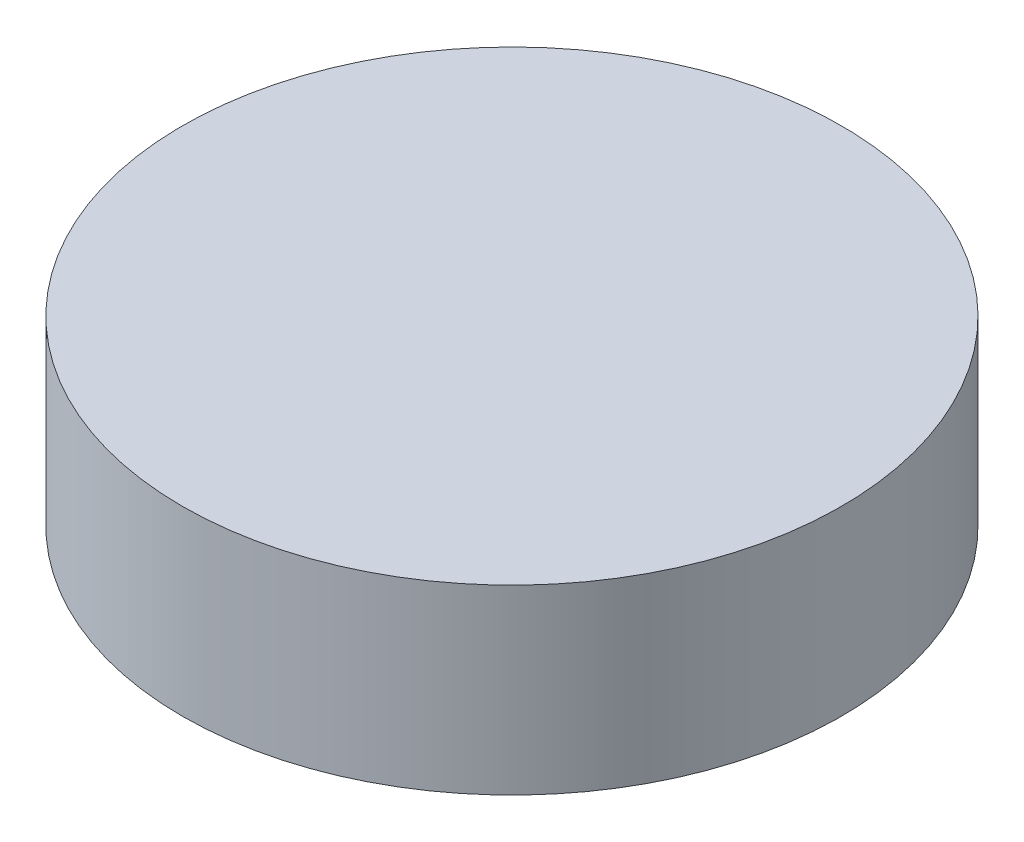
ISO-10303-21;
HEADER;
FILE_DESCRIPTION(('STEP AP214'),'2;1');
FILE_NAME('part.step','',(''),(''),'','','');
FILE_SCHEMA(('AUTOMOTIVE_DESIGN { 1 0 10303 214 1 1 1 1 }'));
ENDSEC;
DATA;
#1=APPLICATION_CONTEXT('core data for automotive mechanical design processes');
#2=APPLICATION_PROTOCOL_DEFINITION('international standard','automotive_design',2000,#1);
#3=PRODUCT_CONTEXT('',#1,'mechanical');
#4=PRODUCT('Part','Part','',(#3));
#5=PRODUCT_RELATED_PRODUCT_CATEGORY('part','',(#4));
#6=PRODUCT_DEFINITION_FORMATION('','',#4);
#7=PRODUCT_DEFINITION_CONTEXT('part definition',#1,'design');
#8=PRODUCT_DEFINITION('design','',#6,#7);
#9=PRODUCT_DEFINITION_SHAPE('','',#8);
#10=(LENGTH_UNIT() NAMED_UNIT(*) SI_UNIT(.MILLI.,.METRE.));
#11=(NAMED_UNIT(*) PLANE_ANGLE_UNIT() SI_UNIT($,.RADIAN.));
#12=(NAMED_UNIT(*) SI_UNIT($,.STERADIAN.) SOLID_ANGLE_UNIT());
#13=UNCERTAINTY_MEASURE_WITH_UNIT(LENGTH_MEASURE(1.E-05),#10,'distance_accuracy_value','');
#14=(GEOMETRIC_REPRESENTATION_CONTEXT(3) GLOBAL_UNCERTAINTY_ASSIGNED_CONTEXT((#13)) GLOBAL_UNIT_ASSIGNED_CONTEXT((#10,
#11,#12)) REPRESENTATION_CONTEXT('',''));
#15=CARTESIAN_POINT('',(0.,0.,0.));
#16=DIRECTION('',(0.,0.,1.));
#17=DIRECTION('',(1.,0.,0.));
#18=AXIS2_PLACEMENT_3D('',#15,#16,#17);
#19=CARTESIAN_POINT('',(0.,5.85,0.));
#20=DIRECTION('',(0.,-1.,0.));
#21=DIRECTION('',(0.,0.,-1.));
#22=AXIS2_PLACEMENT_3D('',#19,#20,#21);
#23=CYLINDRICAL_SURFACE('',#22,10.605);
#24=CARTESIAN_POINT('',(0.,5.85,0.));
#25=DIRECTION('',(0.,1.,0.));
#26=DIRECTION('',(0.,0.,1.));
#27=AXIS2_PLACEMENT_3D('',#24,#25,#26);
#28=CIRCLE('',#27,10.605);
#29=CARTESIAN_POINT('',(0.,5.85,10.605));
#30=VERTEX_POINT('',#29);
#31=EDGE_CURVE('E10',#30,#30,#28,.T.);
#32=ORIENTED_EDGE('',*,*,#31,.F.);
#33=EDGE_LOOP('',(#32));
#34=FACE_BOUND('',#33,.T.);
#35=CARTESIAN_POINT('',(0.,0.,0.));
#36=DIRECTION('',(0.,1.,0.));
#37=DIRECTION('',(0.,0.,1.));
#38=AXIS2_PLACEMENT_3D('',#35,#36,#37);
#39=CIRCLE('',#38,10.605);
#40=CARTESIAN_POINT('',(0.,0.,10.605));
#41=VERTEX_POINT('',#40);
#42=EDGE_CURVE('E38',#41,#41,#39,.T.);
#43=ORIENTED_EDGE('',*,*,#42,.T.);
#44=EDGE_LOOP('',(#43));
#45=FACE_BOUND('',#44,.T.);
#46=ADVANCED_FACE('F35',(#34,#45),#23,.T.);
#47=CARTESIAN_POINT('',(0.,5.85,0.));
#48=DIRECTION('',(0.,1.,0.));
#49=DIRECTION('',(0.,0.,1.));
#50=AXIS2_PLACEMENT_3D('',#47,#48,#49);
#51=PLANE('',#50);
#52=ORIENTED_EDGE('',*,*,#31,.T.);
#53=EDGE_LOOP('',(#52));
#54=FACE_BOUND('',#53,.T.);
#55=ADVANCED_FACE('F50',(#54),#51,.T.);
#56=CARTESIAN_POINT('',(0.,0.,0.));
#57=DIRECTION('',(0.,1.,0.));
#58=DIRECTION('',(0.,0.,1.));
#59=AXIS2_PLACEMENT_3D('',#56,#57,#58);
#60=PLANE('',#59);
#61=ORIENTED_EDGE('',*,*,#42,.F.);
#62=EDGE_LOOP('',(#61));
#63=FACE_BOUND('',#62,.T.);
#64=ADVANCED_FACE('F48',(#63),#60,.F.);
#65=CLOSED_SHELL('',(#46,#55,#64));
#66=MANIFOLD_SOLID_BREP('B2',#65);
#67=ADVANCED_BREP_SHAPE_REPRESENTATION('',(#18,#66),#14);
#68=SHAPE_DEFINITION_REPRESENTATION(#9,#67);
ENDSEC;
END-ISO-10303-21;
